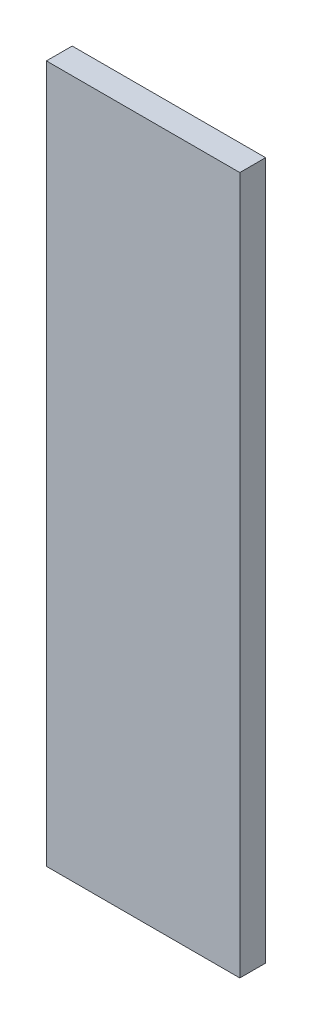
ISO-10303-21;
HEADER;
FILE_DESCRIPTION(('STEP AP214'),'2;1');
FILE_NAME('part.step','',(''),(''),'','','');
FILE_SCHEMA(('AUTOMOTIVE_DESIGN { 1 0 10303 214 1 1 1 1 }'));
ENDSEC;
DATA;
#1=APPLICATION_CONTEXT('core data for automotive mechanical design processes');
#2=APPLICATION_PROTOCOL_DEFINITION('international standard','automotive_design',2000,#1);
#3=PRODUCT_CONTEXT('',#1,'mechanical');
#4=PRODUCT('Part','Part','',(#3));
#5=PRODUCT_RELATED_PRODUCT_CATEGORY('part','',(#4));
#6=PRODUCT_DEFINITION_FORMATION('','',#4);
#7=PRODUCT_DEFINITION_CONTEXT('part definition',#1,'design');
#8=PRODUCT_DEFINITION('design','',#6,#7);
#9=PRODUCT_DEFINITION_SHAPE('','',#8);
#10=(LENGTH_UNIT() NAMED_UNIT(*) SI_UNIT(.MILLI.,.METRE.));
#11=(NAMED_UNIT(*) PLANE_ANGLE_UNIT() SI_UNIT($,.RADIAN.));
#12=(NAMED_UNIT(*) SI_UNIT($,.STERADIAN.) SOLID_ANGLE_UNIT());
#13=UNCERTAINTY_MEASURE_WITH_UNIT(LENGTH_MEASURE(1.E-05),#10,'distance_accuracy_value','');
#14=(GEOMETRIC_REPRESENTATION_CONTEXT(3) GLOBAL_UNCERTAINTY_ASSIGNED_CONTEXT((#13)) GLOBAL_UNIT_ASSIGNED_CONTEXT((#10,
#11,#12)) REPRESENTATION_CONTEXT('',''));
#15=CARTESIAN_POINT('',(0.,0.,0.));
#16=DIRECTION('',(0.,0.,1.));
#17=DIRECTION('',(1.,0.,0.));
#18=AXIS2_PLACEMENT_3D('',#15,#16,#17);
#19=CARTESIAN_POINT('',(0.,0.,2.));
#20=DIRECTION('',(1.,0.,0.));
#21=DIRECTION('',(0.,0.,-1.));
#22=AXIS2_PLACEMENT_3D('',#19,#20,#21);
#23=PLANE('',#22);
#24=DIRECTION('',(0.,-1.,0.));
#25=VECTOR('',#24,1.);
#26=CARTESIAN_POINT('',(0.,0.,0.));
#27=LINE('',#26,#25);
#28=CARTESIAN_POINT('',(0.,54.1,0.));
#29=VERTEX_POINT('',#28);
#30=CARTESIAN_POINT('',(0.,0.,0.));
#31=VERTEX_POINT('',#30);
#32=EDGE_CURVE('E96',#29,#31,#27,.T.);
#33=ORIENTED_EDGE('',*,*,#32,.T.);
#34=DIRECTION('',(0.,0.,-1.));
#35=VECTOR('',#34,1.);
#36=CARTESIAN_POINT('',(0.,0.,2.));
#37=LINE('',#36,#35);
#38=CARTESIAN_POINT('',(0.,0.,2.));
#39=VERTEX_POINT('',#38);
#40=EDGE_CURVE('E11',#39,#31,#37,.T.);
#41=ORIENTED_EDGE('',*,*,#40,.F.);
#42=DIRECTION('',(0.,-1.,0.));
#43=VECTOR('',#42,1.);
#44=CARTESIAN_POINT('',(0.,0.,2.));
#45=LINE('',#44,#43);
#46=CARTESIAN_POINT('',(0.,54.1,2.));
#47=VERTEX_POINT('',#46);
#48=EDGE_CURVE('E84',#47,#39,#45,.T.);
#49=ORIENTED_EDGE('',*,*,#48,.F.);
#50=DIRECTION('',(0.,0.,-1.));
#51=VECTOR('',#50,1.);
#52=CARTESIAN_POINT('',(0.,54.1,2.));
#53=LINE('',#52,#51);
#54=EDGE_CURVE('E92',#47,#29,#53,.T.);
#55=ORIENTED_EDGE('',*,*,#54,.T.);
#56=EDGE_LOOP('',(#33,#41,#49,#55));
#57=FACE_BOUND('',#56,.T.);
#58=ADVANCED_FACE('F33',(#57),#23,.F.);
#59=CARTESIAN_POINT('',(0.,0.,2.));
#60=DIRECTION('',(0.,1.,0.));
#61=DIRECTION('',(0.,0.,1.));
#62=AXIS2_PLACEMENT_3D('',#59,#60,#61);
#63=PLANE('',#62);
#64=DIRECTION('',(1.,0.,0.));
#65=VECTOR('',#64,1.);
#66=CARTESIAN_POINT('',(0.,0.,0.));
#67=LINE('',#66,#65);
#68=CARTESIAN_POINT('',(15.,0.,0.));
#69=VERTEX_POINT('',#68);
#70=EDGE_CURVE('E88',#31,#69,#67,.T.);
#71=ORIENTED_EDGE('',*,*,#70,.T.);
#72=DIRECTION('',(0.,0.,-1.));
#73=VECTOR('',#72,1.);
#74=CARTESIAN_POINT('',(15.,0.,2.));
#75=LINE('',#74,#73);
#76=CARTESIAN_POINT('',(15.,0.,2.));
#77=VERTEX_POINT('',#76);
#78=EDGE_CURVE('E41',#77,#69,#75,.T.);
#79=ORIENTED_EDGE('',*,*,#78,.F.);
#80=DIRECTION('',(1.,0.,0.));
#81=VECTOR('',#80,1.);
#82=CARTESIAN_POINT('',(0.,0.,2.));
#83=LINE('',#82,#81);
#84=EDGE_CURVE('E79',#39,#77,#83,.T.);
#85=ORIENTED_EDGE('',*,*,#84,.F.);
#86=ORIENTED_EDGE('',*,*,#40,.T.);
#87=EDGE_LOOP('',(#71,#79,#85,#86));
#88=FACE_BOUND('',#87,.T.);
#89=ADVANCED_FACE('F87',(#88),#63,.F.);
#90=CARTESIAN_POINT('',(15.,0.,2.));
#91=DIRECTION('',(-1.,0.,0.));
#92=DIRECTION('',(0.,0.,1.));
#93=AXIS2_PLACEMENT_3D('',#90,#91,#92);
#94=PLANE('',#93);
#95=DIRECTION('',(0.,1.,0.));
#96=VECTOR('',#95,1.);
#97=CARTESIAN_POINT('',(15.,0.,0.));
#98=LINE('',#97,#96);
#99=CARTESIAN_POINT('',(15.,54.1,0.));
#100=VERTEX_POINT('',#99);
#101=EDGE_CURVE('E66',#69,#100,#98,.T.);
#102=ORIENTED_EDGE('',*,*,#101,.T.);
#103=DIRECTION('',(0.,0.,-1.));
#104=VECTOR('',#103,1.);
#105=CARTESIAN_POINT('',(15.,54.1,2.));
#106=LINE('',#105,#104);
#107=CARTESIAN_POINT('',(15.,54.1,2.));
#108=VERTEX_POINT('',#107);
#109=EDGE_CURVE('E89',#108,#100,#106,.T.);
#110=ORIENTED_EDGE('',*,*,#109,.F.);
#111=DIRECTION('',(0.,1.,0.));
#112=VECTOR('',#111,1.);
#113=CARTESIAN_POINT('',(15.,0.,2.));
#114=LINE('',#113,#112);
#115=EDGE_CURVE('E82',#77,#108,#114,.T.);
#116=ORIENTED_EDGE('',*,*,#115,.F.);
#117=ORIENTED_EDGE('',*,*,#78,.T.);
#118=EDGE_LOOP('',(#102,#110,#116,#117));
#119=FACE_BOUND('',#118,.T.);
#120=ADVANCED_FACE('F90',(#119),#94,.F.);
#121=CARTESIAN_POINT('',(0.,54.1,2.));
#122=DIRECTION('',(0.,-1.,0.));
#123=DIRECTION('',(0.,0.,-1.));
#124=AXIS2_PLACEMENT_3D('',#121,#122,#123);
#125=PLANE('',#124);
#126=DIRECTION('',(-1.,0.,0.));
#127=VECTOR('',#126,1.);
#128=CARTESIAN_POINT('',(0.,54.1,0.));
#129=LINE('',#128,#127);
#130=EDGE_CURVE('E72',#100,#29,#129,.T.);
#131=ORIENTED_EDGE('',*,*,#130,.T.);
#132=ORIENTED_EDGE('',*,*,#54,.F.);
#133=DIRECTION('',(-1.,0.,0.));
#134=VECTOR('',#133,1.);
#135=CARTESIAN_POINT('',(0.,54.1,2.));
#136=LINE('',#135,#134);
#137=EDGE_CURVE('E49',#108,#47,#136,.T.);
#138=ORIENTED_EDGE('',*,*,#137,.F.);
#139=ORIENTED_EDGE('',*,*,#109,.T.);
#140=EDGE_LOOP('',(#131,#132,#138,#139));
#141=FACE_BOUND('',#140,.T.);
#142=ADVANCED_FACE('F103',(#141),#125,.F.);
#143=CARTESIAN_POINT('',(0.,0.,2.));
#144=DIRECTION('',(0.,0.,-1.));
#145=DIRECTION('',(-1.,0.,0.));
#146=AXIS2_PLACEMENT_3D('',#143,#144,#145);
#147=PLANE('',#146);
#148=ORIENTED_EDGE('',*,*,#48,.T.);
#149=ORIENTED_EDGE('',*,*,#84,.T.);
#150=ORIENTED_EDGE('',*,*,#115,.T.);
#151=ORIENTED_EDGE('',*,*,#137,.T.);
#152=EDGE_LOOP('',(#148,#149,#150,#151));
#153=FACE_BOUND('',#152,.T.);
#154=ADVANCED_FACE('F80',(#153),#147,.F.);
#155=CARTESIAN_POINT('',(0.,0.,0.));
#156=DIRECTION('',(0.,0.,-1.));
#157=DIRECTION('',(-1.,0.,0.));
#158=AXIS2_PLACEMENT_3D('',#155,#156,#157);
#159=PLANE('',#158);
#160=ORIENTED_EDGE('',*,*,#32,.F.);
#161=ORIENTED_EDGE('',*,*,#130,.F.);
#162=ORIENTED_EDGE('',*,*,#101,.F.);
#163=ORIENTED_EDGE('',*,*,#70,.F.);
#164=EDGE_LOOP('',(#160,#161,#162,#163));
#165=FACE_BOUND('',#164,.T.);
#166=ADVANCED_FACE('F106',(#165),#159,.T.);
#167=CLOSED_SHELL('',(#58,#89,#120,#142,#154,#166));
#168=MANIFOLD_SOLID_BREP('B2',#167);
#169=ADVANCED_BREP_SHAPE_REPRESENTATION('',(#18,#168),#14);
#170=SHAPE_DEFINITION_REPRESENTATION(#9,#169);
ENDSEC;
END-ISO-10303-21;
